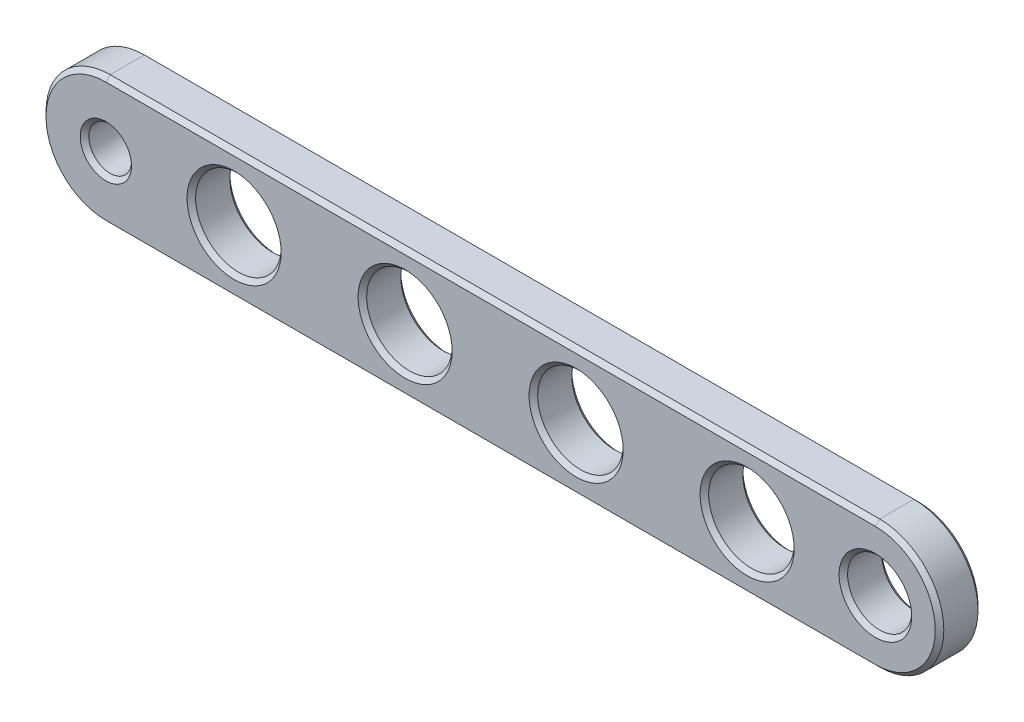
ISO-10303-21;
HEADER;
FILE_DESCRIPTION(('STEP AP214'),'2;1');
FILE_NAME('part.step','',(''),(''),'','','');
FILE_SCHEMA(('AUTOMOTIVE_DESIGN { 1 0 10303 214 1 1 1 1 }'));
ENDSEC;
DATA;
#1=APPLICATION_CONTEXT('core data for automotive mechanical design processes');
#2=APPLICATION_PROTOCOL_DEFINITION('international standard','automotive_design',2000,#1);
#3=PRODUCT_CONTEXT('',#1,'mechanical');
#4=PRODUCT('Part','Part','',(#3));
#5=PRODUCT_RELATED_PRODUCT_CATEGORY('part','',(#4));
#6=PRODUCT_DEFINITION_FORMATION('','',#4);
#7=PRODUCT_DEFINITION_CONTEXT('part definition',#1,'design');
#8=PRODUCT_DEFINITION('design','',#6,#7);
#9=PRODUCT_DEFINITION_SHAPE('','',#8);
#10=(LENGTH_UNIT() NAMED_UNIT(*) SI_UNIT(.MILLI.,.METRE.));
#11=(NAMED_UNIT(*) PLANE_ANGLE_UNIT() SI_UNIT($,.RADIAN.));
#12=(NAMED_UNIT(*) SI_UNIT($,.STERADIAN.) SOLID_ANGLE_UNIT());
#13=UNCERTAINTY_MEASURE_WITH_UNIT(LENGTH_MEASURE(1.E-05),#10,'distance_accuracy_value','');
#14=(GEOMETRIC_REPRESENTATION_CONTEXT(3) GLOBAL_UNCERTAINTY_ASSIGNED_CONTEXT((#13)) GLOBAL_UNIT_ASSIGNED_CONTEXT((#10,
#11,#12)) REPRESENTATION_CONTEXT('',''));
#15=CARTESIAN_POINT('',(0.,0.,0.));
#16=DIRECTION('',(0.,0.,1.));
#17=DIRECTION('',(1.,0.,0.));
#18=AXIS2_PLACEMENT_3D('',#15,#16,#17);
#19=CARTESIAN_POINT('',(-18.,0.,2.));
#20=DIRECTION('',(0.,0.,1.));
#21=DIRECTION('',(1.,0.,0.));
#22=AXIS2_PLACEMENT_3D('',#19,#20,#21);
#23=PLANE('',#22);
#24=CARTESIAN_POINT('',(-12.,0.,2.));
#25=DIRECTION('',(0.,0.,1.));
#26=DIRECTION('',(1.,0.,0.));
#27=AXIS2_PLACEMENT_3D('',#24,#25,#26);
#28=CIRCLE('',#27,2.20000000000001);
#29=CARTESIAN_POINT('',(-9.79999999999999,0.,2.));
#30=VERTEX_POINT('',#29);
#31=EDGE_CURVE('E11',#30,#30,#28,.F.);
#32=ORIENTED_EDGE('',*,*,#31,.T.);
#33=EDGE_LOOP('',(#32));
#34=FACE_BOUND('',#33,.T.);
#35=CARTESIAN_POINT('',(4.,0.,2.));
#36=DIRECTION('',(0.,0.,1.));
#37=DIRECTION('',(1.,0.,0.));
#38=AXIS2_PLACEMENT_3D('',#35,#36,#37);
#39=CIRCLE('',#38,2.20000000000001);
#40=CARTESIAN_POINT('',(6.20000000000001,0.,2.));
#41=VERTEX_POINT('',#40);
#42=EDGE_CURVE('E45',#41,#41,#39,.F.);
#43=ORIENTED_EDGE('',*,*,#42,.T.);
#44=EDGE_LOOP('',(#43));
#45=FACE_BOUND('',#44,.T.);
#46=CARTESIAN_POINT('',(18.,0.,2.));
#47=DIRECTION('',(0.,0.,1.));
#48=DIRECTION('',(1.,0.,0.));
#49=AXIS2_PLACEMENT_3D('',#46,#47,#48);
#50=CIRCLE('',#49,1.7);
#51=CARTESIAN_POINT('',(19.7,0.,2.));
#52=VERTEX_POINT('',#51);
#53=EDGE_CURVE('E219',#52,#52,#50,.F.);
#54=ORIENTED_EDGE('',*,*,#53,.T.);
#55=EDGE_LOOP('',(#54));
#56=FACE_BOUND('',#55,.T.);
#57=CARTESIAN_POINT('',(18.,0.,2.));
#58=DIRECTION('',(0.,0.,1.));
#59=DIRECTION('',(1.,0.,0.));
#60=AXIS2_PLACEMENT_3D('',#57,#58,#59);
#61=CIRCLE('',#60,2.8);
#62=CARTESIAN_POINT('',(18.,-2.8,2.));
#63=VERTEX_POINT('',#62);
#64=CARTESIAN_POINT('',(18.,2.8,2.));
#65=VERTEX_POINT('',#64);
#66=EDGE_CURVE('E53',#63,#65,#61,.T.);
#67=ORIENTED_EDGE('',*,*,#66,.T.);
#68=DIRECTION('',(-1.,0.,0.));
#69=VECTOR('',#68,1.);
#70=CARTESIAN_POINT('',(-18.,2.8,2.));
#71=LINE('',#70,#69);
#72=CARTESIAN_POINT('',(-18.,2.8,2.));
#73=VERTEX_POINT('',#72);
#74=EDGE_CURVE('E217',#65,#73,#71,.T.);
#75=ORIENTED_EDGE('',*,*,#74,.T.);
#76=CARTESIAN_POINT('',(-18.,0.,2.));
#77=DIRECTION('',(0.,0.,1.));
#78=DIRECTION('',(1.,0.,0.));
#79=AXIS2_PLACEMENT_3D('',#76,#77,#78);
#80=CIRCLE('',#79,2.8);
#81=CARTESIAN_POINT('',(-18.,-2.8,2.));
#82=VERTEX_POINT('',#81);
#83=EDGE_CURVE('E213',#73,#82,#80,.T.);
#84=ORIENTED_EDGE('',*,*,#83,.T.);
#85=DIRECTION('',(1.,0.,0.));
#86=VECTOR('',#85,1.);
#87=CARTESIAN_POINT('',(18.,-2.8,2.));
#88=LINE('',#87,#86);
#89=EDGE_CURVE('E58',#82,#63,#88,.T.);
#90=ORIENTED_EDGE('',*,*,#89,.T.);
#91=EDGE_LOOP('',(#67,#75,#84,#90));
#92=FACE_BOUND('',#91,.T.);
#93=CARTESIAN_POINT('',(-18.,0.,2.));
#94=DIRECTION('',(0.,0.,1.));
#95=DIRECTION('',(1.,0.,0.));
#96=AXIS2_PLACEMENT_3D('',#93,#94,#95);
#97=CIRCLE('',#96,1.2);
#98=CARTESIAN_POINT('',(-16.8,0.,2.));
#99=VERTEX_POINT('',#98);
#100=EDGE_CURVE('E210',#99,#99,#97,.F.);
#101=ORIENTED_EDGE('',*,*,#100,.T.);
#102=EDGE_LOOP('',(#101));
#103=FACE_BOUND('',#102,.T.);
#104=CARTESIAN_POINT('',(12.,0.,2.));
#105=DIRECTION('',(0.,0.,1.));
#106=DIRECTION('',(1.,0.,0.));
#107=AXIS2_PLACEMENT_3D('',#104,#105,#106);
#108=CIRCLE('',#107,2.2);
#109=CARTESIAN_POINT('',(14.2,0.,2.));
#110=VERTEX_POINT('',#109);
#111=EDGE_CURVE('E207',#110,#110,#108,.F.);
#112=ORIENTED_EDGE('',*,*,#111,.T.);
#113=EDGE_LOOP('',(#112));
#114=FACE_BOUND('',#113,.T.);
#115=CARTESIAN_POINT('',(-4.,0.,2.));
#116=DIRECTION('',(0.,0.,1.));
#117=DIRECTION('',(1.,0.,0.));
#118=AXIS2_PLACEMENT_3D('',#115,#116,#117);
#119=CIRCLE('',#118,2.20000000000001);
#120=CARTESIAN_POINT('',(-1.79999999999999,0.,2.));
#121=VERTEX_POINT('',#120);
#122=EDGE_CURVE('E204',#121,#121,#119,.F.);
#123=ORIENTED_EDGE('',*,*,#122,.T.);
#124=EDGE_LOOP('',(#123));
#125=FACE_BOUND('',#124,.T.);
#126=ADVANCED_FACE('F35',(#34,#45,#56,#92,#103,#114,#125),#23,.T.);
#127=CARTESIAN_POINT('',(-18.,0.,0.));
#128=DIRECTION('',(0.,0.,1.));
#129=DIRECTION('',(1.,0.,0.));
#130=AXIS2_PLACEMENT_3D('',#127,#128,#129);
#131=PLANE('',#130);
#132=CARTESIAN_POINT('',(-12.,0.,0.));
#133=DIRECTION('',(0.,0.,1.));
#134=DIRECTION('',(1.,0.,0.));
#135=AXIS2_PLACEMENT_3D('',#132,#133,#134);
#136=CIRCLE('',#135,2.2);
#137=CARTESIAN_POINT('',(-9.8,0.,0.));
#138=VERTEX_POINT('',#137);
#139=EDGE_CURVE('E149',#138,#138,#136,.T.);
#140=ORIENTED_EDGE('',*,*,#139,.T.);
#141=EDGE_LOOP('',(#140));
#142=FACE_BOUND('',#141,.T.);
#143=CARTESIAN_POINT('',(-4.,0.,0.));
#144=DIRECTION('',(0.,0.,1.));
#145=DIRECTION('',(1.,0.,0.));
#146=AXIS2_PLACEMENT_3D('',#143,#144,#145);
#147=CIRCLE('',#146,2.2);
#148=CARTESIAN_POINT('',(-6.2,0.,0.));
#149=VERTEX_POINT('',#148);
#150=EDGE_CURVE('E146',#149,#149,#147,.T.);
#151=ORIENTED_EDGE('',*,*,#150,.T.);
#152=EDGE_LOOP('',(#151));
#153=FACE_BOUND('',#152,.T.);
#154=CARTESIAN_POINT('',(4.,0.,0.));
#155=DIRECTION('',(0.,0.,1.));
#156=DIRECTION('',(1.,0.,0.));
#157=AXIS2_PLACEMENT_3D('',#154,#155,#156);
#158=CIRCLE('',#157,2.2);
#159=CARTESIAN_POINT('',(1.8,0.,0.));
#160=VERTEX_POINT('',#159);
#161=EDGE_CURVE('E143',#160,#160,#158,.T.);
#162=ORIENTED_EDGE('',*,*,#161,.T.);
#163=EDGE_LOOP('',(#162));
#164=FACE_BOUND('',#163,.T.);
#165=CARTESIAN_POINT('',(12.,0.,0.));
#166=DIRECTION('',(0.,0.,1.));
#167=DIRECTION('',(1.,0.,0.));
#168=AXIS2_PLACEMENT_3D('',#165,#166,#167);
#169=CIRCLE('',#168,2.2);
#170=CARTESIAN_POINT('',(14.2,0.,0.));
#171=VERTEX_POINT('',#170);
#172=EDGE_CURVE('E140',#171,#171,#169,.T.);
#173=ORIENTED_EDGE('',*,*,#172,.T.);
#174=EDGE_LOOP('',(#173));
#175=FACE_BOUND('',#174,.T.);
#176=CARTESIAN_POINT('',(18.,0.,0.));
#177=DIRECTION('',(0.,0.,1.));
#178=DIRECTION('',(1.,0.,0.));
#179=AXIS2_PLACEMENT_3D('',#176,#177,#178);
#180=CIRCLE('',#179,1.7);
#181=CARTESIAN_POINT('',(19.7,0.,0.));
#182=VERTEX_POINT('',#181);
#183=EDGE_CURVE('E133',#182,#182,#180,.T.);
#184=ORIENTED_EDGE('',*,*,#183,.T.);
#185=EDGE_LOOP('',(#184));
#186=FACE_BOUND('',#185,.T.);
#187=CARTESIAN_POINT('',(-18.,0.,0.));
#188=DIRECTION('',(0.,0.,1.));
#189=DIRECTION('',(1.,0.,0.));
#190=AXIS2_PLACEMENT_3D('',#187,#188,#189);
#191=CIRCLE('',#190,1.2);
#192=CARTESIAN_POINT('',(-16.8,0.,0.));
#193=VERTEX_POINT('',#192);
#194=EDGE_CURVE('E130',#193,#193,#191,.T.);
#195=ORIENTED_EDGE('',*,*,#194,.T.);
#196=EDGE_LOOP('',(#195));
#197=FACE_BOUND('',#196,.T.);
#198=CARTESIAN_POINT('',(18.,0.,0.));
#199=DIRECTION('',(0.,0.,1.));
#200=DIRECTION('',(1.,0.,0.));
#201=AXIS2_PLACEMENT_3D('',#198,#199,#200);
#202=CIRCLE('',#201,2.80000000000001);
#203=CARTESIAN_POINT('',(18.,2.80000000000002,0.));
#204=VERTEX_POINT('',#203);
#205=CARTESIAN_POINT('',(18.,-2.80000000000001,0.));
#206=VERTEX_POINT('',#205);
#207=EDGE_CURVE('E129',#204,#206,#202,.F.);
#208=ORIENTED_EDGE('',*,*,#207,.T.);
#209=DIRECTION('',(-1.,0.,0.));
#210=VECTOR('',#209,1.);
#211=CARTESIAN_POINT('',(-18.,-2.80000000000001,0.));
#212=LINE('',#211,#210);
#213=CARTESIAN_POINT('',(-18.,-2.80000000000001,0.));
#214=VERTEX_POINT('',#213);
#215=EDGE_CURVE('E108',#206,#214,#212,.T.);
#216=ORIENTED_EDGE('',*,*,#215,.T.);
#217=CARTESIAN_POINT('',(-18.,0.,0.));
#218=DIRECTION('',(0.,0.,1.));
#219=DIRECTION('',(1.,0.,0.));
#220=AXIS2_PLACEMENT_3D('',#217,#218,#219);
#221=CIRCLE('',#220,2.80000000000001);
#222=CARTESIAN_POINT('',(-18.,2.80000000000001,0.));
#223=VERTEX_POINT('',#222);
#224=EDGE_CURVE('E118',#214,#223,#221,.F.);
#225=ORIENTED_EDGE('',*,*,#224,.T.);
#226=DIRECTION('',(1.,0.,0.));
#227=VECTOR('',#226,1.);
#228=CARTESIAN_POINT('',(-18.,2.80000000000001,0.));
#229=LINE('',#228,#227);
#230=EDGE_CURVE('E124',#223,#204,#229,.T.);
#231=ORIENTED_EDGE('',*,*,#230,.T.);
#232=EDGE_LOOP('',(#208,#216,#225,#231));
#233=FACE_BOUND('',#232,.T.);
#234=ADVANCED_FACE('F127',(#142,#153,#164,#175,#186,#197,#233),#131,.F.);
#235=CARTESIAN_POINT('',(-18.,0.,2.));
#236=DIRECTION('',(0.,0.,-1.));
#237=DIRECTION('',(-1.,0.,0.));
#238=AXIS2_PLACEMENT_3D('',#235,#236,#237);
#239=CYLINDRICAL_SURFACE('',#238,3.00000000000001);
#240=DIRECTION('',(0.,0.,-1.));
#241=VECTOR('',#240,1.);
#242=CARTESIAN_POINT('',(-18.,3.00000000000001,2.));
#243=LINE('',#242,#241);
#244=CARTESIAN_POINT('',(-18.,3.00000000000001,1.8));
#245=VERTEX_POINT('',#244);
#246=CARTESIAN_POINT('',(-18.,3.00000000000001,0.199999999999997));
#247=VERTEX_POINT('',#246);
#248=EDGE_CURVE('E228',#245,#247,#243,.T.);
#249=ORIENTED_EDGE('',*,*,#248,.T.);
#250=CARTESIAN_POINT('',(-18.,0.,0.199999999999997));
#251=DIRECTION('',(0.,0.,1.));
#252=DIRECTION('',(1.,0.,0.));
#253=AXIS2_PLACEMENT_3D('',#250,#251,#252);
#254=CIRCLE('',#253,3.00000000000001);
#255=CARTESIAN_POINT('',(-18.,-3.00000000000001,0.199999999999997));
#256=VERTEX_POINT('',#255);
#257=EDGE_CURVE('E202',#247,#256,#254,.T.);
#258=ORIENTED_EDGE('',*,*,#257,.T.);
#259=DIRECTION('',(0.,0.,-1.));
#260=VECTOR('',#259,1.);
#261=CARTESIAN_POINT('',(-18.,-3.00000000000001,2.));
#262=LINE('',#261,#260);
#263=CARTESIAN_POINT('',(-18.,-3.00000000000001,1.8));
#264=VERTEX_POINT('',#263);
#265=EDGE_CURVE('E125',#264,#256,#262,.T.);
#266=ORIENTED_EDGE('',*,*,#265,.F.);
#267=CARTESIAN_POINT('',(-18.,0.,1.8));
#268=DIRECTION('',(0.,0.,1.));
#269=DIRECTION('',(1.,0.,0.));
#270=AXIS2_PLACEMENT_3D('',#267,#268,#269);
#271=CIRCLE('',#270,3.00000000000001);
#272=EDGE_CURVE('E200',#264,#245,#271,.F.);
#273=ORIENTED_EDGE('',*,*,#272,.T.);
#274=EDGE_LOOP('',(#249,#258,#266,#273));
#275=FACE_BOUND('',#274,.T.);
#276=ADVANCED_FACE('F254',(#275),#239,.T.);
#277=CARTESIAN_POINT('',(-18.,-3.00000000000001,2.));
#278=DIRECTION('',(0.,1.,0.));
#279=DIRECTION('',(-1.,0.,0.));
#280=AXIS2_PLACEMENT_3D('',#277,#278,#279);
#281=PLANE('',#280);
#282=ORIENTED_EDGE('',*,*,#265,.T.);
#283=DIRECTION('',(1.,0.,0.));
#284=VECTOR('',#283,1.);
#285=CARTESIAN_POINT('',(-18.,-3.00000000000001,0.199999999999997));
#286=LINE('',#285,#284);
#287=CARTESIAN_POINT('',(18.,-3.00000000000001,0.199999999999997));
#288=VERTEX_POINT('',#287);
#289=EDGE_CURVE('E111',#256,#288,#286,.T.);
#290=ORIENTED_EDGE('',*,*,#289,.T.);
#291=DIRECTION('',(0.,0.,-1.));
#292=VECTOR('',#291,1.);
#293=CARTESIAN_POINT('',(18.,-3.00000000000001,2.));
#294=LINE('',#293,#292);
#295=CARTESIAN_POINT('',(18.,-3.00000000000001,1.8));
#296=VERTEX_POINT('',#295);
#297=EDGE_CURVE('E251',#296,#288,#294,.T.);
#298=ORIENTED_EDGE('',*,*,#297,.F.);
#299=DIRECTION('',(-1.,0.,0.));
#300=VECTOR('',#299,1.);
#301=CARTESIAN_POINT('',(-18.,-3.00000000000001,1.8));
#302=LINE('',#301,#300);
#303=EDGE_CURVE('E188',#296,#264,#302,.T.);
#304=ORIENTED_EDGE('',*,*,#303,.T.);
#305=EDGE_LOOP('',(#282,#290,#298,#304));
#306=FACE_BOUND('',#305,.T.);
#307=ADVANCED_FACE('F249',(#306),#281,.F.);
#308=CARTESIAN_POINT('',(18.,0.,2.));
#309=DIRECTION('',(0.,0.,-1.));
#310=DIRECTION('',(-1.,0.,0.));
#311=AXIS2_PLACEMENT_3D('',#308,#309,#310);
#312=CYLINDRICAL_SURFACE('',#311,3.00000000000001);
#313=ORIENTED_EDGE('',*,*,#297,.T.);
#314=CARTESIAN_POINT('',(18.,0.,0.199999999999997));
#315=DIRECTION('',(0.,0.,1.));
#316=DIRECTION('',(1.,0.,0.));
#317=AXIS2_PLACEMENT_3D('',#314,#315,#316);
#318=CIRCLE('',#317,3.00000000000001);
#319=CARTESIAN_POINT('',(18.,3.00000000000001,0.199999999999997));
#320=VERTEX_POINT('',#319);
#321=EDGE_CURVE('E193',#288,#320,#318,.T.);
#322=ORIENTED_EDGE('',*,*,#321,.T.);
#323=DIRECTION('',(0.,0.,-1.));
#324=VECTOR('',#323,1.);
#325=CARTESIAN_POINT('',(18.,3.00000000000001,2.));
#326=LINE('',#325,#324);
#327=CARTESIAN_POINT('',(18.,3.00000000000001,1.8));
#328=VERTEX_POINT('',#327);
#329=EDGE_CURVE('E257',#328,#320,#326,.T.);
#330=ORIENTED_EDGE('',*,*,#329,.F.);
#331=CARTESIAN_POINT('',(18.,0.,1.8));
#332=DIRECTION('',(0.,0.,1.));
#333=DIRECTION('',(1.,0.,0.));
#334=AXIS2_PLACEMENT_3D('',#331,#332,#333);
#335=CIRCLE('',#334,3.00000000000001);
#336=EDGE_CURVE('E191',#328,#296,#335,.F.);
#337=ORIENTED_EDGE('',*,*,#336,.T.);
#338=EDGE_LOOP('',(#313,#322,#330,#337));
#339=FACE_BOUND('',#338,.T.);
#340=ADVANCED_FACE('F270',(#339),#312,.T.);
#341=CARTESIAN_POINT('',(-18.,3.00000000000001,2.));
#342=DIRECTION('',(0.,-1.,0.));
#343=DIRECTION('',(1.,0.,0.));
#344=AXIS2_PLACEMENT_3D('',#341,#342,#343);
#345=PLANE('',#344);
#346=ORIENTED_EDGE('',*,*,#329,.T.);
#347=DIRECTION('',(-1.,0.,0.));
#348=VECTOR('',#347,1.);
#349=CARTESIAN_POINT('',(-18.,3.00000000000001,0.199999999999997));
#350=LINE('',#349,#348);
#351=EDGE_CURVE('E198',#320,#247,#350,.T.);
#352=ORIENTED_EDGE('',*,*,#351,.T.);
#353=ORIENTED_EDGE('',*,*,#248,.F.);
#354=DIRECTION('',(1.,0.,0.));
#355=VECTOR('',#354,1.);
#356=CARTESIAN_POINT('',(18.,3.00000000000001,1.8));
#357=LINE('',#356,#355);
#358=EDGE_CURVE('E195',#245,#328,#357,.T.);
#359=ORIENTED_EDGE('',*,*,#358,.T.);
#360=EDGE_LOOP('',(#346,#352,#353,#359));
#361=FACE_BOUND('',#360,.T.);
#362=ADVANCED_FACE('F274',(#361),#345,.F.);
#363=CARTESIAN_POINT('',(-18.,0.,2.));
#364=DIRECTION('',(0.,0.,-1.));
#365=DIRECTION('',(-1.,0.,0.));
#366=AXIS2_PLACEMENT_3D('',#363,#364,#365);
#367=CYLINDRICAL_SURFACE('',#366,1.);
#368=CARTESIAN_POINT('',(-18.,0.,0.200000000000002));
#369=DIRECTION('',(0.,0.,1.));
#370=DIRECTION('',(1.,0.,0.));
#371=AXIS2_PLACEMENT_3D('',#368,#369,#370);
#372=CIRCLE('',#371,1.);
#373=CARTESIAN_POINT('',(-17.,0.,0.200000000000002));
#374=VERTEX_POINT('',#373);
#375=EDGE_CURVE('E185',#374,#374,#372,.F.);
#376=ORIENTED_EDGE('',*,*,#375,.T.);
#377=EDGE_LOOP('',(#376));
#378=FACE_BOUND('',#377,.T.);
#379=CARTESIAN_POINT('',(-18.,0.,1.8));
#380=DIRECTION('',(0.,0.,1.));
#381=DIRECTION('',(1.,0.,0.));
#382=AXIS2_PLACEMENT_3D('',#379,#380,#381);
#383=CIRCLE('',#382,1.);
#384=CARTESIAN_POINT('',(-17.,0.,1.8));
#385=VERTEX_POINT('',#384);
#386=EDGE_CURVE('E182',#385,#385,#383,.T.);
#387=ORIENTED_EDGE('',*,*,#386,.T.);
#388=EDGE_LOOP('',(#387));
#389=FACE_BOUND('',#388,.T.);
#390=ADVANCED_FACE('F318',(#378,#389),#367,.F.);
#391=CARTESIAN_POINT('',(18.,0.,2.));
#392=DIRECTION('',(0.,0.,-1.));
#393=DIRECTION('',(-1.,0.,0.));
#394=AXIS2_PLACEMENT_3D('',#391,#392,#393);
#395=CYLINDRICAL_SURFACE('',#394,1.5);
#396=CARTESIAN_POINT('',(18.,0.,0.200000000000001));
#397=DIRECTION('',(0.,0.,1.));
#398=DIRECTION('',(1.,0.,0.));
#399=AXIS2_PLACEMENT_3D('',#396,#397,#398);
#400=CIRCLE('',#399,1.5);
#401=CARTESIAN_POINT('',(19.5,0.,0.200000000000001));
#402=VERTEX_POINT('',#401);
#403=EDGE_CURVE('E179',#402,#402,#400,.F.);
#404=ORIENTED_EDGE('',*,*,#403,.T.);
#405=EDGE_LOOP('',(#404));
#406=FACE_BOUND('',#405,.T.);
#407=CARTESIAN_POINT('',(18.,0.,1.8));
#408=DIRECTION('',(0.,0.,1.));
#409=DIRECTION('',(1.,0.,0.));
#410=AXIS2_PLACEMENT_3D('',#407,#408,#409);
#411=CIRCLE('',#410,1.5);
#412=CARTESIAN_POINT('',(19.5,0.,1.8));
#413=VERTEX_POINT('',#412);
#414=EDGE_CURVE('E176',#413,#413,#411,.T.);
#415=ORIENTED_EDGE('',*,*,#414,.T.);
#416=EDGE_LOOP('',(#415));
#417=FACE_BOUND('',#416,.T.);
#418=ADVANCED_FACE('F314',(#406,#417),#395,.F.);
#419=CARTESIAN_POINT('',(12.,0.,2.));
#420=DIRECTION('',(0.,0.,-1.));
#421=DIRECTION('',(-1.,0.,0.));
#422=AXIS2_PLACEMENT_3D('',#419,#420,#421);
#423=CYLINDRICAL_SURFACE('',#422,2.);
#424=CARTESIAN_POINT('',(12.,0.,0.199999999999997));
#425=DIRECTION('',(0.,0.,1.));
#426=DIRECTION('',(1.,0.,0.));
#427=AXIS2_PLACEMENT_3D('',#424,#425,#426);
#428=CIRCLE('',#427,2.);
#429=CARTESIAN_POINT('',(14.,0.,0.199999999999997));
#430=VERTEX_POINT('',#429);
#431=EDGE_CURVE('E173',#430,#430,#428,.F.);
#432=ORIENTED_EDGE('',*,*,#431,.T.);
#433=EDGE_LOOP('',(#432));
#434=FACE_BOUND('',#433,.T.);
#435=CARTESIAN_POINT('',(12.,0.,1.8));
#436=DIRECTION('',(0.,0.,1.));
#437=DIRECTION('',(1.,0.,0.));
#438=AXIS2_PLACEMENT_3D('',#435,#436,#437);
#439=CIRCLE('',#438,2.);
#440=CARTESIAN_POINT('',(14.,0.,1.8));
#441=VERTEX_POINT('',#440);
#442=EDGE_CURVE('E170',#441,#441,#439,.T.);
#443=ORIENTED_EDGE('',*,*,#442,.T.);
#444=EDGE_LOOP('',(#443));
#445=FACE_BOUND('',#444,.T.);
#446=ADVANCED_FACE('F308',(#434,#445),#423,.F.);
#447=CARTESIAN_POINT('',(4.,0.,2.));
#448=DIRECTION('',(0.,0.,-1.));
#449=DIRECTION('',(-1.,0.,0.));
#450=AXIS2_PLACEMENT_3D('',#447,#448,#449);
#451=CYLINDRICAL_SURFACE('',#450,2.);
#452=CARTESIAN_POINT('',(4.,0.,0.2));
#453=DIRECTION('',(0.,0.,1.));
#454=DIRECTION('',(1.,0.,0.));
#455=AXIS2_PLACEMENT_3D('',#452,#453,#454);
#456=CIRCLE('',#455,2.);
#457=CARTESIAN_POINT('',(2.,0.,0.2));
#458=VERTEX_POINT('',#457);
#459=EDGE_CURVE('E167',#458,#458,#456,.F.);
#460=ORIENTED_EDGE('',*,*,#459,.T.);
#461=EDGE_LOOP('',(#460));
#462=FACE_BOUND('',#461,.T.);
#463=CARTESIAN_POINT('',(4.,0.,1.79999999999999));
#464=DIRECTION('',(0.,0.,1.));
#465=DIRECTION('',(1.,0.,0.));
#466=AXIS2_PLACEMENT_3D('',#463,#464,#465);
#467=CIRCLE('',#466,2.);
#468=CARTESIAN_POINT('',(6.,0.,1.79999999999999));
#469=VERTEX_POINT('',#468);
#470=EDGE_CURVE('E164',#469,#469,#467,.T.);
#471=ORIENTED_EDGE('',*,*,#470,.T.);
#472=EDGE_LOOP('',(#471));
#473=FACE_BOUND('',#472,.T.);
#474=ADVANCED_FACE('F298',(#462,#473),#451,.F.);
#475=CARTESIAN_POINT('',(-4.,0.,2.));
#476=DIRECTION('',(0.,0.,-1.));
#477=DIRECTION('',(-1.,0.,0.));
#478=AXIS2_PLACEMENT_3D('',#475,#476,#477);
#479=CYLINDRICAL_SURFACE('',#478,2.);
#480=CARTESIAN_POINT('',(-4.,0.,0.2));
#481=DIRECTION('',(0.,0.,1.));
#482=DIRECTION('',(1.,0.,0.));
#483=AXIS2_PLACEMENT_3D('',#480,#481,#482);
#484=CIRCLE('',#483,2.);
#485=CARTESIAN_POINT('',(-6.,0.,0.2));
#486=VERTEX_POINT('',#485);
#487=EDGE_CURVE('E161',#486,#486,#484,.F.);
#488=ORIENTED_EDGE('',*,*,#487,.T.);
#489=EDGE_LOOP('',(#488));
#490=FACE_BOUND('',#489,.T.);
#491=CARTESIAN_POINT('',(-4.,0.,1.79999999999999));
#492=DIRECTION('',(0.,0.,1.));
#493=DIRECTION('',(1.,0.,0.));
#494=AXIS2_PLACEMENT_3D('',#491,#492,#493);
#495=CIRCLE('',#494,2.);
#496=CARTESIAN_POINT('',(-2.,0.,1.79999999999999));
#497=VERTEX_POINT('',#496);
#498=EDGE_CURVE('E158',#497,#497,#495,.T.);
#499=ORIENTED_EDGE('',*,*,#498,.T.);
#500=EDGE_LOOP('',(#499));
#501=FACE_BOUND('',#500,.T.);
#502=ADVANCED_FACE('F295',(#490,#501),#479,.F.);
#503=CARTESIAN_POINT('',(-12.,0.,2.));
#504=DIRECTION('',(0.,0.,-1.));
#505=DIRECTION('',(-1.,0.,0.));
#506=AXIS2_PLACEMENT_3D('',#503,#504,#505);
#507=CYLINDRICAL_SURFACE('',#506,2.);
#508=CARTESIAN_POINT('',(-12.,0.,0.199999999999997));
#509=DIRECTION('',(0.,0.,1.));
#510=DIRECTION('',(1.,0.,0.));
#511=AXIS2_PLACEMENT_3D('',#508,#509,#510);
#512=CIRCLE('',#511,2.);
#513=CARTESIAN_POINT('',(-10.,0.,0.199999999999997));
#514=VERTEX_POINT('',#513);
#515=EDGE_CURVE('E155',#514,#514,#512,.F.);
#516=ORIENTED_EDGE('',*,*,#515,.T.);
#517=EDGE_LOOP('',(#516));
#518=FACE_BOUND('',#517,.T.);
#519=CARTESIAN_POINT('',(-12.,0.,1.79999999999999));
#520=DIRECTION('',(0.,0.,1.));
#521=DIRECTION('',(1.,0.,0.));
#522=AXIS2_PLACEMENT_3D('',#519,#520,#521);
#523=CIRCLE('',#522,2.);
#524=CARTESIAN_POINT('',(-10.,0.,1.79999999999999));
#525=VERTEX_POINT('',#524);
#526=EDGE_CURVE('E152',#525,#525,#523,.T.);
#527=ORIENTED_EDGE('',*,*,#526,.T.);
#528=EDGE_LOOP('',(#527));
#529=FACE_BOUND('',#528,.T.);
#530=ADVANCED_FACE('F297',(#518,#529),#507,.F.);
#531=CARTESIAN_POINT('',(-12.,0.,0.));
#532=DIRECTION('',(0.,0.,-1.));
#533=DIRECTION('',(-1.,0.,0.));
#534=AXIS2_PLACEMENT_3D('',#531,#532,#533);
#535=CONICAL_SURFACE('',#534,2.2,0.785398163397448);
#536=ORIENTED_EDGE('',*,*,#515,.F.);
#537=EDGE_LOOP('',(#536));
#538=FACE_BOUND('',#537,.T.);
#539=ORIENTED_EDGE('',*,*,#139,.F.);
#540=EDGE_LOOP('',(#539));
#541=FACE_BOUND('',#540,.T.);
#542=ADVANCED_FACE('F305',(#538,#541),#535,.F.);
#543=CARTESIAN_POINT('',(-4.,0.,0.));
#544=DIRECTION('',(0.,0.,-1.));
#545=DIRECTION('',(-1.,0.,0.));
#546=AXIS2_PLACEMENT_3D('',#543,#544,#545);
#547=CONICAL_SURFACE('',#546,2.2,0.785398163397441);
#548=CARTESIAN_POINT('',(-6.,0.,0.2));
#549=CARTESIAN_POINT('',(-6.00208333333333,0.,0.197916666666666));
#550=CARTESIAN_POINT('',(-6.00416666666667,0.,0.195833333333333));
#551=CARTESIAN_POINT('',(-6.00833333333333,0.,0.191666666666666));
#552=CARTESIAN_POINT('',(-6.01041666666667,0.,0.189583333333333));
#553=CARTESIAN_POINT('',(-6.01458333333333,0.,0.185416666666666));
#554=CARTESIAN_POINT('',(-6.01666666666666,0.,0.183333333333333));
#555=CARTESIAN_POINT('',(-6.02083333333333,0.,0.179166666666666));
#556=CARTESIAN_POINT('',(-6.02291666666667,0.,0.177083333333333));
#557=CARTESIAN_POINT('',(-6.02708333333333,0.,0.172916666666666));
#558=CARTESIAN_POINT('',(-6.02916666666667,0.,0.170833333333333));
#559=CARTESIAN_POINT('',(-6.03333333333333,0.,0.166666666666666));
#560=CARTESIAN_POINT('',(-6.03541666666666,0.,0.164583333333333));
#561=CARTESIAN_POINT('',(-6.03958333333333,0.,0.160416666666666));
#562=CARTESIAN_POINT('',(-6.04166666666667,0.,0.158333333333333));
#563=CARTESIAN_POINT('',(-6.04583333333333,0.,0.154166666666666));
#564=CARTESIAN_POINT('',(-6.04791666666666,0.,0.152083333333333));
#565=CARTESIAN_POINT('',(-6.05208333333333,0.,0.147916666666666));
#566=CARTESIAN_POINT('',(-6.05416666666666,0.,0.145833333333333));
#567=CARTESIAN_POINT('',(-6.05833333333333,0.,0.141666666666666));
#568=CARTESIAN_POINT('',(-6.06041666666666,0.,0.139583333333333));
#569=CARTESIAN_POINT('',(-6.06458333333333,0.,0.135416666666666));
#570=CARTESIAN_POINT('',(-6.06666666666666,0.,0.133333333333333));
#571=CARTESIAN_POINT('',(-6.07083333333333,0.,0.129166666666666));
#572=CARTESIAN_POINT('',(-6.07291666666666,0.,0.127083333333333));
#573=CARTESIAN_POINT('',(-6.07708333333333,0.,0.122916666666666));
#574=CARTESIAN_POINT('',(-6.07916666666666,0.,0.120833333333333));
#575=CARTESIAN_POINT('',(-6.08333333333333,0.,0.116666666666667));
#576=CARTESIAN_POINT('',(-6.08541666666666,0.,0.114583333333333));
#577=CARTESIAN_POINT('',(-6.08958333333333,0.,0.110416666666667));
#578=CARTESIAN_POINT('',(-6.09166666666666,0.,0.108333333333333));
#579=CARTESIAN_POINT('',(-6.09583333333333,0.,0.104166666666666));
#580=CARTESIAN_POINT('',(-6.09791666666666,0.,0.102083333333333));
#581=CARTESIAN_POINT('',(-6.10208333333333,0.,0.0979166666666665));
#582=CARTESIAN_POINT('',(-6.10416666666666,0.,0.0958333333333333));
#583=CARTESIAN_POINT('',(-6.10833333333333,0.,0.0916666666666665));
#584=CARTESIAN_POINT('',(-6.11041666666666,0.,0.089583333333333));
#585=CARTESIAN_POINT('',(-6.11458333333333,0.,0.0854166666666664));
#586=CARTESIAN_POINT('',(-6.11666666666666,0.,0.0833333333333333));
#587=CARTESIAN_POINT('',(-6.12083333333333,0.,0.0791666666666667));
#588=CARTESIAN_POINT('',(-6.12291666666666,0.,0.0770833333333333));
#589=CARTESIAN_POINT('',(-6.12708333333333,0.,0.0729166666666664));
#590=CARTESIAN_POINT('',(-6.12916666666666,0.,0.070833333333333));
#591=CARTESIAN_POINT('',(-6.13333333333333,0.,0.0666666666666664));
#592=CARTESIAN_POINT('',(-6.13541666666666,0.,0.0645833333333333));
#593=CARTESIAN_POINT('',(-6.13958333333333,0.,0.0604166666666667));
#594=CARTESIAN_POINT('',(-6.14166666666666,0.,0.0583333333333333));
#595=CARTESIAN_POINT('',(-6.14583333333333,0.,0.0541666666666665));
#596=CARTESIAN_POINT('',(-6.14791666666666,0.,0.052083333333333));
#597=CARTESIAN_POINT('',(-6.15208333333333,0.,0.0479166666666665));
#598=CARTESIAN_POINT('',(-6.15416666666666,0.,0.0458333333333333));
#599=CARTESIAN_POINT('',(-6.15833333333333,0.,0.0416666666666668));
#600=CARTESIAN_POINT('',(-6.16041666666666,0.,0.0395833333333334));
#601=CARTESIAN_POINT('',(-6.16458333333333,0.,0.0354166666666665));
#602=CARTESIAN_POINT('',(-6.16666666666666,0.,0.0333333333333331));
#603=CARTESIAN_POINT('',(-6.17083333333333,0.,0.0291666666666665));
#604=CARTESIAN_POINT('',(-6.17291666666666,0.,0.0270833333333334));
#605=CARTESIAN_POINT('',(-6.17708333333333,0.,0.0229166666666668));
#606=CARTESIAN_POINT('',(-6.17916666666666,0.,0.0208333333333334));
#607=CARTESIAN_POINT('',(-6.18333333333333,0.,0.0166666666666665));
#608=CARTESIAN_POINT('',(-6.18541666666666,0.,0.0145833333333331));
#609=CARTESIAN_POINT('',(-6.18958333333333,0.,0.0104166666666665));
#610=CARTESIAN_POINT('',(-6.19166666666666,0.,0.00833333333333333));
#611=CARTESIAN_POINT('',(-6.19583333333333,0.,0.00416666666666694));
#612=CARTESIAN_POINT('',(-6.19791666666666,0.,0.00208333333333374));
#613=CARTESIAN_POINT('',(-6.2,0.,0.));
#614=B_SPLINE_CURVE_WITH_KNOTS('',3,(#548,#549,#550,#551,#552,#553,#554,#555,#556,#557,#558,
#559,#560,#561,#562,#563,#564,#565,#566,#567,#568,#569,#570,#571,#572,#573,#574,#575,#576,#577,
#578,#579,#580,#581,#582,#583,#584,#585,#586,#587,#588,#589,#590,#591,#592,#593,#594,#595,#596,
#597,#598,#599,#600,#601,#602,#603,#604,#605,#606,#607,#608,#609,#610,#611,#612,#613),
.UNSPECIFIED.,.F.,.F.,(4,2,2,2,2,2,2,2,2,2,2,2,2,2,2,2,2,2,2,2,2,2,2,2,2,2,2,2,2,2,2,2,4),(0.,
0.00883883476483196,0.0176776695296639,0.0265165042944953,0.0353553390593272,0.0441941738241592,
0.0530330085889906,0.0618718433538225,0.0707106781186545,0.0795495128834858,0.0883883476483178,
0.0972271824131498,0.106066017177981,0.114904851942813,0.123743686707645,0.132582521472476,
0.141421356237308,0.15026019100214,0.159099025766972,0.167937860531804,0.176776695296636,
0.185615530061467,0.1944543648263,0.203293199591131,0.212132034355962,0.220970869120795,
0.229809703885626,0.238648538650457,0.24748737341529,0.256326208180121,0.265165042944953,
0.274003877709785,0.282842712474617),.UNSPECIFIED.);
#615=EDGE_CURVE('BSEAM340',#486,#149,#614,.T.);
#616=ORIENTED_EDGE('',*,*,#487,.F.);
#617=ORIENTED_EDGE('',*,*,#150,.F.);
#618=ORIENTED_EDGE('',*,*,#615,.T.);
#619=ORIENTED_EDGE('',*,*,#615,.F.);
#620=EDGE_LOOP('',(#616,#618,#617,#619));
#621=FACE_BOUND('',#620,.T.);
#622=ADVANCED_FACE('F340',(#621),#547,.F.);
#623=CARTESIAN_POINT('',(4.,0.,0.));
#624=DIRECTION('',(0.,0.,-1.));
#625=DIRECTION('',(-1.,0.,0.));
#626=AXIS2_PLACEMENT_3D('',#623,#624,#625);
#627=CONICAL_SURFACE('',#626,2.2,0.785398163397441);
#628=CARTESIAN_POINT('',(2.,0.,0.2));
#629=CARTESIAN_POINT('',(1.99791666666667,0.,0.197916666666666));
#630=CARTESIAN_POINT('',(1.99583333333333,0.,0.195833333333333));
#631=CARTESIAN_POINT('',(1.99166666666667,0.,0.191666666666666));
#632=CARTESIAN_POINT('',(1.98958333333334,0.,0.189583333333333));
#633=CARTESIAN_POINT('',(1.98541666666667,0.,0.185416666666666));
#634=CARTESIAN_POINT('',(1.98333333333333,0.,0.183333333333333));
#635=CARTESIAN_POINT('',(1.97916666666667,0.,0.179166666666666));
#636=CARTESIAN_POINT('',(1.97708333333334,0.,0.177083333333333));
#637=CARTESIAN_POINT('',(1.97291666666667,0.,0.172916666666666));
#638=CARTESIAN_POINT('',(1.97083333333334,0.,0.170833333333333));
#639=CARTESIAN_POINT('',(1.96666666666667,0.,0.166666666666666));
#640=CARTESIAN_POINT('',(1.96458333333334,0.,0.164583333333333));
#641=CARTESIAN_POINT('',(1.96041666666667,0.,0.160416666666666));
#642=CARTESIAN_POINT('',(1.95833333333334,0.,0.158333333333333));
#643=CARTESIAN_POINT('',(1.95416666666667,0.,0.154166666666666));
#644=CARTESIAN_POINT('',(1.95208333333334,0.,0.152083333333333));
#645=CARTESIAN_POINT('',(1.94791666666667,0.,0.147916666666666));
#646=CARTESIAN_POINT('',(1.94583333333334,0.,0.145833333333333));
#647=CARTESIAN_POINT('',(1.94166666666667,0.,0.141666666666666));
#648=CARTESIAN_POINT('',(1.93958333333334,0.,0.139583333333333));
#649=CARTESIAN_POINT('',(1.93541666666667,0.,0.135416666666666));
#650=CARTESIAN_POINT('',(1.93333333333334,0.,0.133333333333333));
#651=CARTESIAN_POINT('',(1.92916666666667,0.,0.129166666666666));
#652=CARTESIAN_POINT('',(1.92708333333334,0.,0.127083333333333));
#653=CARTESIAN_POINT('',(1.92291666666667,0.,0.122916666666666));
#654=CARTESIAN_POINT('',(1.92083333333334,0.,0.120833333333333));
#655=CARTESIAN_POINT('',(1.91666666666667,0.,0.116666666666666));
#656=CARTESIAN_POINT('',(1.91458333333334,0.,0.114583333333333));
#657=CARTESIAN_POINT('',(1.91041666666667,0.,0.110416666666667));
#658=CARTESIAN_POINT('',(1.90833333333334,0.,0.108333333333333));
#659=CARTESIAN_POINT('',(1.90416666666667,0.,0.104166666666666));
#660=CARTESIAN_POINT('',(1.90208333333334,0.,0.102083333333333));
#661=CARTESIAN_POINT('',(1.89791666666667,0.,0.0979166666666665));
#662=CARTESIAN_POINT('',(1.89583333333334,0.,0.0958333333333332));
#663=CARTESIAN_POINT('',(1.89166666666667,0.,0.0916666666666665));
#664=CARTESIAN_POINT('',(1.88958333333334,0.,0.0895833333333331));
#665=CARTESIAN_POINT('',(1.88541666666667,0.,0.0854166666666665));
#666=CARTESIAN_POINT('',(1.88333333333334,0.,0.0833333333333332));
#667=CARTESIAN_POINT('',(1.87916666666667,0.,0.0791666666666666));
#668=CARTESIAN_POINT('',(1.87708333333334,0.,0.0770833333333332));
#669=CARTESIAN_POINT('',(1.87291666666667,0.,0.0729166666666665));
#670=CARTESIAN_POINT('',(1.87083333333334,0.,0.0708333333333332));
#671=CARTESIAN_POINT('',(1.86666666666667,0.,0.0666666666666665));
#672=CARTESIAN_POINT('',(1.86458333333334,0.,0.0645833333333332));
#673=CARTESIAN_POINT('',(1.86041666666667,0.,0.0604166666666666));
#674=CARTESIAN_POINT('',(1.85833333333334,0.,0.0583333333333333));
#675=CARTESIAN_POINT('',(1.85416666666667,0.,0.0541666666666665));
#676=CARTESIAN_POINT('',(1.85208333333334,0.,0.0520833333333332));
#677=CARTESIAN_POINT('',(1.84791666666667,0.,0.0479166666666666));
#678=CARTESIAN_POINT('',(1.84583333333334,0.,0.0458333333333333));
#679=CARTESIAN_POINT('',(1.84166666666667,0.,0.0416666666666666));
#680=CARTESIAN_POINT('',(1.83958333333334,0.,0.0395833333333333));
#681=CARTESIAN_POINT('',(1.83541666666667,0.,0.0354166666666666));
#682=CARTESIAN_POINT('',(1.83333333333334,0.,0.0333333333333332));
#683=CARTESIAN_POINT('',(1.82916666666667,0.,0.0291666666666666));
#684=CARTESIAN_POINT('',(1.82708333333334,0.,0.0270833333333333));
#685=CARTESIAN_POINT('',(1.82291666666667,0.,0.0229166666666667));
#686=CARTESIAN_POINT('',(1.82083333333334,0.,0.0208333333333333));
#687=CARTESIAN_POINT('',(1.81666666666667,0.,0.0166666666666666));
#688=CARTESIAN_POINT('',(1.81458333333334,0.,0.0145833333333333));
#689=CARTESIAN_POINT('',(1.81041666666667,0.,0.0104166666666666));
#690=CARTESIAN_POINT('',(1.80833333333334,0.,0.00833333333333332));
#691=CARTESIAN_POINT('',(1.80416666666667,0.,0.00416666666666673));
#692=CARTESIAN_POINT('',(1.80208333333334,0.,0.00208333333333343));
#693=CARTESIAN_POINT('',(1.8,0.,0.));
#694=B_SPLINE_CURVE_WITH_KNOTS('',3,(#628,#629,#630,#631,#632,#633,#634,#635,#636,#637,#638,
#639,#640,#641,#642,#643,#644,#645,#646,#647,#648,#649,#650,#651,#652,#653,#654,#655,#656,#657,
#658,#659,#660,#661,#662,#663,#664,#665,#666,#667,#668,#669,#670,#671,#672,#673,#674,#675,#676,
#677,#678,#679,#680,#681,#682,#683,#684,#685,#686,#687,#688,#689,#690,#691,#692,#693),
.UNSPECIFIED.,.F.,.F.,(4,2,2,2,2,2,2,2,2,2,2,2,2,2,2,2,2,2,2,2,2,2,2,2,2,2,2,2,2,2,2,2,4),(0.,
0.00883883476483166,0.0176776695296636,0.0265165042944953,0.0353553390593269,0.0441941738241589,
0.0530330085889906,0.0618718433538222,0.0707106781186542,0.0795495128834858,0.0883883476483175,
0.0972271824131494,0.106066017177981,0.114904851942813,0.123743686707645,0.132582521472476,
0.141421356237308,0.15026019100214,0.159099025766972,0.167937860531804,0.176776695296635,
0.185615530061467,0.194454364826299,0.203293199591131,0.212132034355962,0.220970869120794,
0.229809703885626,0.238648538650458,0.247487373415289,0.256326208180121,0.265165042944953,
0.274003877709785,0.282842712474616),.UNSPECIFIED.);
#695=EDGE_CURVE('BSEAM347',#458,#160,#694,.T.);
#696=ORIENTED_EDGE('',*,*,#459,.F.);
#697=ORIENTED_EDGE('',*,*,#161,.F.);
#698=ORIENTED_EDGE('',*,*,#695,.T.);
#699=ORIENTED_EDGE('',*,*,#695,.F.);
#700=EDGE_LOOP('',(#696,#698,#697,#699));
#701=FACE_BOUND('',#700,.T.);
#702=ADVANCED_FACE('F347',(#701),#627,.F.);
#703=CARTESIAN_POINT('',(12.,0.,0.));
#704=DIRECTION('',(0.,0.,-1.));
#705=DIRECTION('',(-1.,0.,0.));
#706=AXIS2_PLACEMENT_3D('',#703,#704,#705);
#707=CONICAL_SURFACE('',#706,2.2,0.785398163397448);
#708=ORIENTED_EDGE('',*,*,#431,.F.);
#709=EDGE_LOOP('',(#708));
#710=FACE_BOUND('',#709,.T.);
#711=ORIENTED_EDGE('',*,*,#172,.F.);
#712=EDGE_LOOP('',(#711));
#713=FACE_BOUND('',#712,.T.);
#714=ADVANCED_FACE('F354',(#710,#713),#707,.F.);
#715=CARTESIAN_POINT('',(18.,0.,0.));
#716=DIRECTION('',(0.,0.,-1.));
#717=DIRECTION('',(-1.,0.,0.));
#718=AXIS2_PLACEMENT_3D('',#715,#716,#717);
#719=CONICAL_SURFACE('',#718,1.7,0.785398163397444);
#720=ORIENTED_EDGE('',*,*,#403,.F.);
#721=EDGE_LOOP('',(#720));
#722=FACE_BOUND('',#721,.T.);
#723=ORIENTED_EDGE('',*,*,#183,.F.);
#724=EDGE_LOOP('',(#723));
#725=FACE_BOUND('',#724,.T.);
#726=ADVANCED_FACE('F361',(#722,#725),#719,.F.);
#727=CARTESIAN_POINT('',(-18.,0.,0.));
#728=DIRECTION('',(0.,0.,-1.));
#729=DIRECTION('',(-1.,0.,0.));
#730=AXIS2_PLACEMENT_3D('',#727,#728,#729);
#731=CONICAL_SURFACE('',#730,1.2,0.785398163397448);
#732=ORIENTED_EDGE('',*,*,#375,.F.);
#733=EDGE_LOOP('',(#732));
#734=FACE_BOUND('',#733,.T.);
#735=ORIENTED_EDGE('',*,*,#194,.F.);
#736=EDGE_LOOP('',(#735));
#737=FACE_BOUND('',#736,.T.);
#738=ADVANCED_FACE('F368',(#734,#737),#731,.F.);
#739=CARTESIAN_POINT('',(-18.,3.00000000000001,0.199999999999997));
#740=DIRECTION('',(0.,-0.707106781186551,0.707106781186544));
#741=DIRECTION('',(-1.,0.,0.));
#742=AXIS2_PLACEMENT_3D('',#739,#740,#741);
#743=PLANE('',#742);
#744=DIRECTION('',(0.,0.707106781186544,0.707106781186551));
#745=VECTOR('',#744,1.);
#746=CARTESIAN_POINT('',(18.,2.80000000000002,0.));
#747=LINE('',#746,#745);
#748=EDGE_CURVE('E114',#204,#320,#747,.T.);
#749=ORIENTED_EDGE('',*,*,#748,.F.);
#750=ORIENTED_EDGE('',*,*,#230,.F.);
#751=DIRECTION('',(0.,-0.707106781186544,-0.707106781186551));
#752=VECTOR('',#751,1.);
#753=CARTESIAN_POINT('',(-18.,3.00000000000001,0.199999999999997));
#754=LINE('',#753,#752);
#755=EDGE_CURVE('E121',#247,#223,#754,.T.);
#756=ORIENTED_EDGE('',*,*,#755,.F.);
#757=ORIENTED_EDGE('',*,*,#351,.F.);
#758=EDGE_LOOP('',(#749,#750,#756,#757));
#759=FACE_BOUND('',#758,.T.);
#760=ADVANCED_FACE('F263',(#759),#743,.F.);
#761=CARTESIAN_POINT('',(-18.,0.,0.199999999999997));
#762=DIRECTION('',(0.,0.,1.));
#763=DIRECTION('',(1.,0.,0.));
#764=AXIS2_PLACEMENT_3D('',#761,#762,#763);
#765=CONICAL_SURFACE('',#764,3.00000000000001,0.785398163397444);
#766=ORIENTED_EDGE('',*,*,#755,.T.);
#767=ORIENTED_EDGE('',*,*,#224,.F.);
#768=DIRECTION('',(0.,0.707106781186544,-0.707106781186551));
#769=VECTOR('',#768,1.);
#770=CARTESIAN_POINT('',(-18.,-3.00000000000001,0.199999999999997));
#771=LINE('',#770,#769);
#772=EDGE_CURVE('E104',#256,#214,#771,.T.);
#773=ORIENTED_EDGE('',*,*,#772,.F.);
#774=ORIENTED_EDGE('',*,*,#257,.F.);
#775=EDGE_LOOP('',(#766,#767,#773,#774));
#776=FACE_BOUND('',#775,.T.);
#777=ADVANCED_FACE('F119',(#776),#765,.T.);
#778=CARTESIAN_POINT('',(18.,0.,0.199999999999997));
#779=DIRECTION('',(0.,0.,1.));
#780=DIRECTION('',(1.,0.,0.));
#781=AXIS2_PLACEMENT_3D('',#778,#779,#780);
#782=CONICAL_SURFACE('',#781,3.00000000000001,0.785398163397444);
#783=ORIENTED_EDGE('',*,*,#748,.T.);
#784=ORIENTED_EDGE('',*,*,#321,.F.);
#785=DIRECTION('',(0.,-0.707106781186544,0.707106781186551));
#786=VECTOR('',#785,1.);
#787=CARTESIAN_POINT('',(18.,-2.80000000000001,0.));
#788=LINE('',#787,#786);
#789=EDGE_CURVE('E115',#206,#288,#788,.T.);
#790=ORIENTED_EDGE('',*,*,#789,.F.);
#791=ORIENTED_EDGE('',*,*,#207,.F.);
#792=EDGE_LOOP('',(#783,#784,#790,#791));
#793=FACE_BOUND('',#792,.T.);
#794=ADVANCED_FACE('F266',(#793),#782,.T.);
#795=CARTESIAN_POINT('',(-18.,-3.00000000000001,0.199999999999997));
#796=DIRECTION('',(0.,0.707106781186551,0.707106781186544));
#797=DIRECTION('',(1.,0.,0.));
#798=AXIS2_PLACEMENT_3D('',#795,#796,#797);
#799=PLANE('',#798);
#800=ORIENTED_EDGE('',*,*,#772,.T.);
#801=ORIENTED_EDGE('',*,*,#215,.F.);
#802=ORIENTED_EDGE('',*,*,#789,.T.);
#803=ORIENTED_EDGE('',*,*,#289,.F.);
#804=EDGE_LOOP('',(#800,#801,#802,#803));
#805=FACE_BOUND('',#804,.T.);
#806=ADVANCED_FACE('F106',(#805),#799,.F.);
#807=CARTESIAN_POINT('',(-12.,0.,1.79999999999999));
#808=DIRECTION('',(0.,0.,1.));
#809=DIRECTION('',(1.,0.,0.));
#810=AXIS2_PLACEMENT_3D('',#807,#808,#809);
#811=CONICAL_SURFACE('',#810,2.,0.785398163397447);
#812=ORIENTED_EDGE('',*,*,#31,.F.);
#813=EDGE_LOOP('',(#812));
#814=FACE_BOUND('',#813,.T.);
#815=ORIENTED_EDGE('',*,*,#526,.F.);
#816=EDGE_LOOP('',(#815));
#817=FACE_BOUND('',#816,.T.);
#818=ADVANCED_FACE('F383',(#814,#817),#811,.F.);
#819=CARTESIAN_POINT('',(4.,0.,1.79999999999999));
#820=DIRECTION('',(0.,0.,1.));
#821=DIRECTION('',(1.,0.,0.));
#822=AXIS2_PLACEMENT_3D('',#819,#820,#821);
#823=CONICAL_SURFACE('',#822,2.,0.785398163397448);
#824=ORIENTED_EDGE('',*,*,#42,.F.);
#825=EDGE_LOOP('',(#824));
#826=FACE_BOUND('',#825,.T.);
#827=ORIENTED_EDGE('',*,*,#470,.F.);
#828=EDGE_LOOP('',(#827));
#829=FACE_BOUND('',#828,.T.);
#830=ADVANCED_FACE('F402',(#826,#829),#823,.F.);
#831=CARTESIAN_POINT('',(18.,0.,1.8));
#832=DIRECTION('',(0.,0.,1.));
#833=DIRECTION('',(1.,0.,0.));
#834=AXIS2_PLACEMENT_3D('',#831,#832,#833);
#835=CONICAL_SURFACE('',#834,1.5,0.785398163397454);
#836=ORIENTED_EDGE('',*,*,#53,.F.);
#837=EDGE_LOOP('',(#836));
#838=FACE_BOUND('',#837,.T.);
#839=ORIENTED_EDGE('',*,*,#414,.F.);
#840=EDGE_LOOP('',(#839));
#841=FACE_BOUND('',#840,.T.);
#842=ADVANCED_FACE('F409',(#838,#841),#835,.F.);
#843=CARTESIAN_POINT('',(-18.,-2.8,2.));
#844=DIRECTION('',(0.,-0.707106781186544,0.707106781186551));
#845=DIRECTION('',(-1.,0.,0.));
#846=AXIS2_PLACEMENT_3D('',#843,#844,#845);
#847=PLANE('',#846);
#848=DIRECTION('',(0.,0.707106781186551,0.707106781186544));
#849=VECTOR('',#848,1.);
#850=CARTESIAN_POINT('',(-18.,-3.00000000000001,1.8));
#851=LINE('',#850,#849);
#852=EDGE_CURVE('E232',#264,#82,#851,.T.);
#853=ORIENTED_EDGE('',*,*,#852,.F.);
#854=ORIENTED_EDGE('',*,*,#303,.F.);
#855=DIRECTION('',(0.,-0.707106781186551,-0.707106781186544));
#856=VECTOR('',#855,1.);
#857=CARTESIAN_POINT('',(18.,-2.8,2.));
#858=LINE('',#857,#856);
#859=EDGE_CURVE('E40',#63,#296,#858,.T.);
#860=ORIENTED_EDGE('',*,*,#859,.F.);
#861=ORIENTED_EDGE('',*,*,#89,.F.);
#862=EDGE_LOOP('',(#853,#854,#860,#861));
#863=FACE_BOUND('',#862,.T.);
#864=ADVANCED_FACE('F244',(#863),#847,.T.);
#865=CARTESIAN_POINT('',(18.,0.,2.));
#866=DIRECTION('',(0.,0.,-1.));
#867=DIRECTION('',(-1.,0.,0.));
#868=AXIS2_PLACEMENT_3D('',#865,#866,#867);
#869=CONICAL_SURFACE('',#868,2.8,0.785398163397453);
#870=ORIENTED_EDGE('',*,*,#859,.T.);
#871=ORIENTED_EDGE('',*,*,#336,.F.);
#872=DIRECTION('',(0.,0.707106781186551,-0.707106781186544));
#873=VECTOR('',#872,1.);
#874=CARTESIAN_POINT('',(18.,2.8,2.));
#875=LINE('',#874,#873);
#876=EDGE_CURVE('E231',#65,#328,#875,.T.);
#877=ORIENTED_EDGE('',*,*,#876,.F.);
#878=ORIENTED_EDGE('',*,*,#66,.F.);
#879=EDGE_LOOP('',(#870,#871,#877,#878));
#880=FACE_BOUND('',#879,.T.);
#881=ADVANCED_FACE('F241',(#880),#869,.T.);
#882=CARTESIAN_POINT('',(-18.,0.,2.));
#883=DIRECTION('',(0.,0.,-1.));
#884=DIRECTION('',(-1.,0.,0.));
#885=AXIS2_PLACEMENT_3D('',#882,#883,#884);
#886=CONICAL_SURFACE('',#885,2.8,0.785398163397453);
#887=ORIENTED_EDGE('',*,*,#852,.T.);
#888=ORIENTED_EDGE('',*,*,#83,.F.);
#889=DIRECTION('',(0.,-0.707106781186551,0.707106781186544));
#890=VECTOR('',#889,1.);
#891=CARTESIAN_POINT('',(-18.,3.00000000000001,1.8));
#892=LINE('',#891,#890);
#893=EDGE_CURVE('E229',#245,#73,#892,.T.);
#894=ORIENTED_EDGE('',*,*,#893,.F.);
#895=ORIENTED_EDGE('',*,*,#272,.F.);
#896=EDGE_LOOP('',(#887,#888,#894,#895));
#897=FACE_BOUND('',#896,.T.);
#898=ADVANCED_FACE('F279',(#897),#886,.T.);
#899=CARTESIAN_POINT('',(-18.,2.8,2.));
#900=DIRECTION('',(0.,0.707106781186544,0.707106781186551));
#901=DIRECTION('',(1.,0.,0.));
#902=AXIS2_PLACEMENT_3D('',#899,#900,#901);
#903=PLANE('',#902);
#904=ORIENTED_EDGE('',*,*,#876,.T.);
#905=ORIENTED_EDGE('',*,*,#358,.F.);
#906=ORIENTED_EDGE('',*,*,#893,.T.);
#907=ORIENTED_EDGE('',*,*,#74,.F.);
#908=EDGE_LOOP('',(#904,#905,#906,#907));
#909=FACE_BOUND('',#908,.T.);
#910=ADVANCED_FACE('F277',(#909),#903,.T.);
#911=CARTESIAN_POINT('',(-18.,0.,1.8));
#912=DIRECTION('',(0.,0.,1.));
#913=DIRECTION('',(1.,0.,0.));
#914=AXIS2_PLACEMENT_3D('',#911,#912,#913);
#915=CONICAL_SURFACE('',#914,1.,0.785398163397443);
#916=ORIENTED_EDGE('',*,*,#100,.F.);
#917=EDGE_LOOP('',(#916));
#918=FACE_BOUND('',#917,.T.);
#919=ORIENTED_EDGE('',*,*,#386,.F.);
#920=EDGE_LOOP('',(#919));
#921=FACE_BOUND('',#920,.T.);
#922=ADVANCED_FACE('F424',(#918,#921),#915,.F.);
#923=CARTESIAN_POINT('',(12.,0.,1.8));
#924=DIRECTION('',(0.,0.,1.));
#925=DIRECTION('',(1.,0.,0.));
#926=AXIS2_PLACEMENT_3D('',#923,#924,#925);
#927=CONICAL_SURFACE('',#926,2.,0.785398163397447);
#928=ORIENTED_EDGE('',*,*,#111,.F.);
#929=EDGE_LOOP('',(#928));
#930=FACE_BOUND('',#929,.T.);
#931=ORIENTED_EDGE('',*,*,#442,.F.);
#932=EDGE_LOOP('',(#931));
#933=FACE_BOUND('',#932,.T.);
#934=ADVANCED_FACE('F292',(#930,#933),#927,.F.);
#935=CARTESIAN_POINT('',(-4.,0.,1.79999999999999));
#936=DIRECTION('',(0.,0.,1.));
#937=DIRECTION('',(1.,0.,0.));
#938=AXIS2_PLACEMENT_3D('',#935,#936,#937);
#939=CONICAL_SURFACE('',#938,2.,0.785398163397448);
#940=ORIENTED_EDGE('',*,*,#122,.F.);
#941=EDGE_LOOP('',(#940));
#942=FACE_BOUND('',#941,.T.);
#943=ORIENTED_EDGE('',*,*,#498,.F.);
#944=EDGE_LOOP('',(#943));
#945=FACE_BOUND('',#944,.T.);
#946=ADVANCED_FACE('F38',(#942,#945),#939,.F.);
#947=CLOSED_SHELL('',(#126,#234,#276,#307,#340,#362,#390,#418,#446,#474,#502,#530,#542,#622,
#702,#714,#726,#738,#760,#777,#794,#806,#818,#830,#842,#864,#881,#898,#910,#922,#934,#946));
#948=MANIFOLD_SOLID_BREP('B2',#947);
#949=ADVANCED_BREP_SHAPE_REPRESENTATION('',(#18,#948),#14);
#950=SHAPE_DEFINITION_REPRESENTATION(#9,#949);
ENDSEC;
END-ISO-10303-21;
